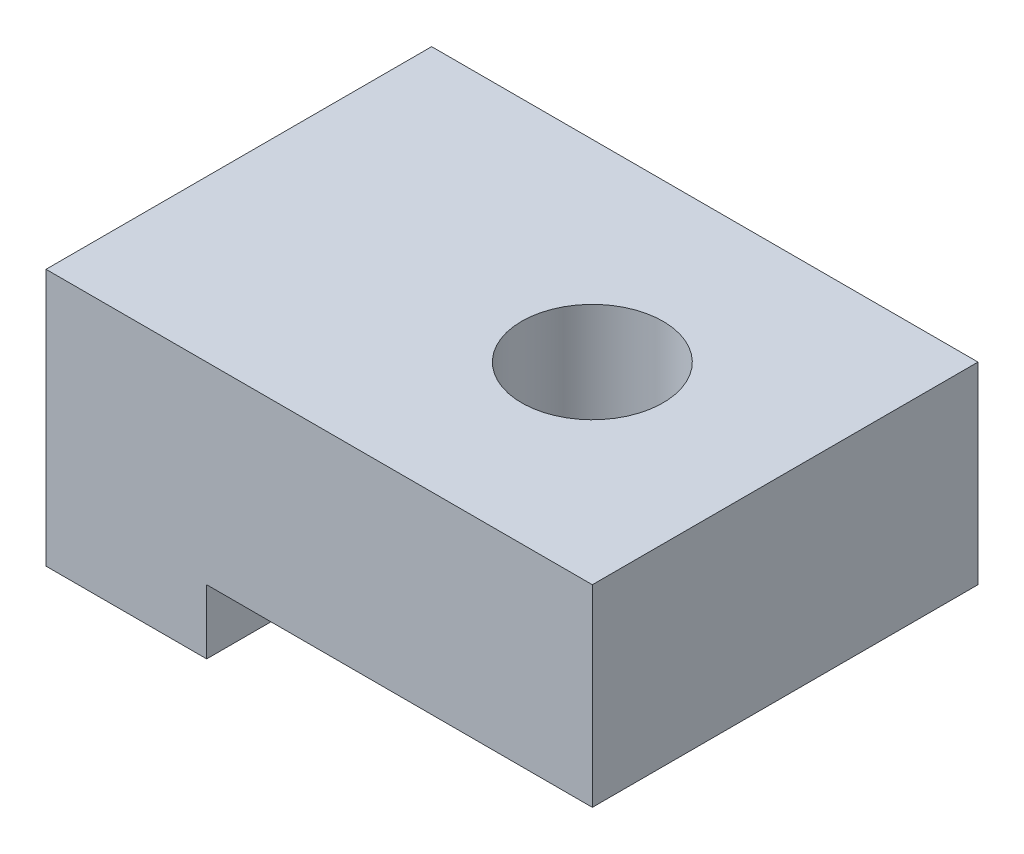
ISO-10303-21;
HEADER;
FILE_DESCRIPTION(('STEP AP214'),'2;1');
FILE_NAME('part.step','',(''),(''),'','','');
FILE_SCHEMA(('AUTOMOTIVE_DESIGN { 1 0 10303 214 1 1 1 1 }'));
ENDSEC;
DATA;
#1=APPLICATION_CONTEXT('core data for automotive mechanical design processes');
#2=APPLICATION_PROTOCOL_DEFINITION('international standard','automotive_design',2000,#1);
#3=PRODUCT_CONTEXT('',#1,'mechanical');
#4=PRODUCT('Part','Part','',(#3));
#5=PRODUCT_RELATED_PRODUCT_CATEGORY('part','',(#4));
#6=PRODUCT_DEFINITION_FORMATION('','',#4);
#7=PRODUCT_DEFINITION_CONTEXT('part definition',#1,'design');
#8=PRODUCT_DEFINITION('design','',#6,#7);
#9=PRODUCT_DEFINITION_SHAPE('','',#8);
#10=(LENGTH_UNIT() NAMED_UNIT(*) SI_UNIT(.MILLI.,.METRE.));
#11=(NAMED_UNIT(*) PLANE_ANGLE_UNIT() SI_UNIT($,.RADIAN.));
#12=(NAMED_UNIT(*) SI_UNIT($,.STERADIAN.) SOLID_ANGLE_UNIT());
#13=UNCERTAINTY_MEASURE_WITH_UNIT(LENGTH_MEASURE(1.E-05),#10,'distance_accuracy_value','');
#14=(GEOMETRIC_REPRESENTATION_CONTEXT(3) GLOBAL_UNCERTAINTY_ASSIGNED_CONTEXT((#13)) GLOBAL_UNIT_ASSIGNED_CONTEXT((#10,
#11,#12)) REPRESENTATION_CONTEXT('',''));
#15=CARTESIAN_POINT('',(0.,0.,0.));
#16=DIRECTION('',(0.,0.,1.));
#17=DIRECTION('',(1.,0.,0.));
#18=AXIS2_PLACEMENT_3D('',#15,#16,#17);
#19=CARTESIAN_POINT('',(0.,0.,30.));
#20=DIRECTION('',(-1.,0.,0.));
#21=DIRECTION('',(0.,-1.,0.));
#22=AXIS2_PLACEMENT_3D('',#19,#20,#21);
#23=PLANE('',#22);
#24=DIRECTION('',(0.,1.,0.));
#25=VECTOR('',#24,1.);
#26=CARTESIAN_POINT('',(0.,0.,30.));
#27=LINE('',#26,#25);
#28=CARTESIAN_POINT('',(0.,-30.,30.));
#29=VERTEX_POINT('',#28);
#30=CARTESIAN_POINT('',(0.,0.,30.));
#31=VERTEX_POINT('',#30);
#32=EDGE_CURVE('E82',#29,#31,#27,.T.);
#33=ORIENTED_EDGE('',*,*,#32,.F.);
#34=DIRECTION('',(0.,0.,1.));
#35=VECTOR('',#34,1.);
#36=CARTESIAN_POINT('',(0.,-30.,-30.));
#37=LINE('',#36,#35);
#38=CARTESIAN_POINT('',(0.,-30.,-30.));
#39=VERTEX_POINT('',#38);
#40=EDGE_CURVE('E104',#39,#29,#37,.T.);
#41=ORIENTED_EDGE('',*,*,#40,.F.);
#42=DIRECTION('',(0.,1.,0.));
#43=VECTOR('',#42,1.);
#44=CARTESIAN_POINT('',(0.,0.,-30.));
#45=LINE('',#44,#43);
#46=CARTESIAN_POINT('',(0.,0.,-30.));
#47=VERTEX_POINT('',#46);
#48=EDGE_CURVE('E130',#39,#47,#45,.T.);
#49=ORIENTED_EDGE('',*,*,#48,.T.);
#50=DIRECTION('',(0.,0.,-1.));
#51=VECTOR('',#50,1.);
#52=CARTESIAN_POINT('',(0.,0.,30.));
#53=LINE('',#52,#51);
#54=EDGE_CURVE('E11',#31,#47,#53,.T.);
#55=ORIENTED_EDGE('',*,*,#54,.F.);
#56=EDGE_LOOP('',(#33,#41,#49,#55));
#57=FACE_BOUND('',#56,.T.);
#58=ADVANCED_FACE('F36',(#57),#23,.F.);
#59=CARTESIAN_POINT('',(0.,0.,30.));
#60=DIRECTION('',(0.,-1.,0.));
#61=DIRECTION('',(1.,0.,0.));
#62=AXIS2_PLACEMENT_3D('',#59,#60,#61);
#63=PLANE('',#62);
#64=CARTESIAN_POINT('',(-30.,0.,0.));
#65=DIRECTION('',(0.,1.,0.));
#66=DIRECTION('',(-1.,0.,0.));
#67=AXIS2_PLACEMENT_3D('',#64,#65,#66);
#68=CIRCLE('',#67,11.);
#69=CARTESIAN_POINT('',(-41.,0.,0.));
#70=VERTEX_POINT('',#69);
#71=EDGE_CURVE('E147',#70,#70,#68,.T.);
#72=ORIENTED_EDGE('',*,*,#71,.F.);
#73=EDGE_LOOP('',(#72));
#74=FACE_BOUND('',#73,.T.);
#75=DIRECTION('',(-1.,0.,0.));
#76=VECTOR('',#75,1.);
#77=CARTESIAN_POINT('',(0.,0.,-30.));
#78=LINE('',#77,#76);
#79=CARTESIAN_POINT('',(-85.,0.,-30.));
#80=VERTEX_POINT('',#79);
#81=EDGE_CURVE('E120',#47,#80,#78,.T.);
#82=ORIENTED_EDGE('',*,*,#81,.T.);
#83=DIRECTION('',(0.,0.,-1.));
#84=VECTOR('',#83,1.);
#85=CARTESIAN_POINT('',(-85.,0.,30.));
#86=LINE('',#85,#84);
#87=CARTESIAN_POINT('',(-85.,0.,30.));
#88=VERTEX_POINT('',#87);
#89=EDGE_CURVE('E44',#88,#80,#86,.T.);
#90=ORIENTED_EDGE('',*,*,#89,.F.);
#91=DIRECTION('',(-1.,0.,0.));
#92=VECTOR('',#91,1.);
#93=CARTESIAN_POINT('',(0.,0.,30.));
#94=LINE('',#93,#92);
#95=EDGE_CURVE('E118',#31,#88,#94,.T.);
#96=ORIENTED_EDGE('',*,*,#95,.F.);
#97=ORIENTED_EDGE('',*,*,#54,.T.);
#98=EDGE_LOOP('',(#82,#90,#96,#97));
#99=FACE_BOUND('',#98,.T.);
#100=ADVANCED_FACE('F132',(#74,#99),#63,.F.);
#101=CARTESIAN_POINT('',(-85.,0.,30.));
#102=DIRECTION('',(1.,0.,0.));
#103=DIRECTION('',(0.,0.,-1.));
#104=AXIS2_PLACEMENT_3D('',#101,#102,#103);
#105=PLANE('',#104);
#106=DIRECTION('',(0.,-1.,0.));
#107=VECTOR('',#106,1.);
#108=CARTESIAN_POINT('',(-85.,0.,-30.));
#109=LINE('',#108,#107);
#110=CARTESIAN_POINT('',(-85.,-40.,-30.));
#111=VERTEX_POINT('',#110);
#112=EDGE_CURVE('E77',#80,#111,#109,.T.);
#113=ORIENTED_EDGE('',*,*,#112,.T.);
#114=DIRECTION('',(0.,0.,-1.));
#115=VECTOR('',#114,1.);
#116=CARTESIAN_POINT('',(-85.,-40.,30.));
#117=LINE('',#116,#115);
#118=CARTESIAN_POINT('',(-85.,-40.,30.));
#119=VERTEX_POINT('',#118);
#120=EDGE_CURVE('E116',#119,#111,#117,.T.);
#121=ORIENTED_EDGE('',*,*,#120,.F.);
#122=DIRECTION('',(0.,-1.,0.));
#123=VECTOR('',#122,1.);
#124=CARTESIAN_POINT('',(-85.,0.,30.));
#125=LINE('',#124,#123);
#126=EDGE_CURVE('E60',#88,#119,#125,.T.);
#127=ORIENTED_EDGE('',*,*,#126,.F.);
#128=ORIENTED_EDGE('',*,*,#89,.T.);
#129=EDGE_LOOP('',(#113,#121,#127,#128));
#130=FACE_BOUND('',#129,.T.);
#131=ADVANCED_FACE('F127',(#130),#105,.F.);
#132=CARTESIAN_POINT('',(0.,-40.,30.));
#133=DIRECTION('',(0.,1.,0.));
#134=DIRECTION('',(-1.,0.,0.));
#135=AXIS2_PLACEMENT_3D('',#132,#133,#134);
#136=PLANE('',#135);
#137=DIRECTION('',(1.,0.,0.));
#138=VECTOR('',#137,1.);
#139=CARTESIAN_POINT('',(0.,-40.,-30.));
#140=LINE('',#139,#138);
#141=CARTESIAN_POINT('',(-60.,-40.,-30.));
#142=VERTEX_POINT('',#141);
#143=EDGE_CURVE('E111',#111,#142,#140,.T.);
#144=ORIENTED_EDGE('',*,*,#143,.T.);
#145=DIRECTION('',(0.,0.,1.));
#146=VECTOR('',#145,1.);
#147=CARTESIAN_POINT('',(-60.,-40.,-30.));
#148=LINE('',#147,#146);
#149=CARTESIAN_POINT('',(-60.,-40.,30.));
#150=VERTEX_POINT('',#149);
#151=EDGE_CURVE('E97',#142,#150,#148,.T.);
#152=ORIENTED_EDGE('',*,*,#151,.T.);
#153=DIRECTION('',(1.,0.,0.));
#154=VECTOR('',#153,1.);
#155=CARTESIAN_POINT('',(0.,-40.,30.));
#156=LINE('',#155,#154);
#157=EDGE_CURVE('E125',#119,#150,#156,.T.);
#158=ORIENTED_EDGE('',*,*,#157,.F.);
#159=ORIENTED_EDGE('',*,*,#120,.T.);
#160=EDGE_LOOP('',(#144,#152,#158,#159));
#161=FACE_BOUND('',#160,.T.);
#162=ADVANCED_FACE('F115',(#161),#136,.F.);
#163=CARTESIAN_POINT('',(0.,0.,30.));
#164=DIRECTION('',(0.,0.,-1.));
#165=DIRECTION('',(-1.,0.,0.));
#166=AXIS2_PLACEMENT_3D('',#163,#164,#165);
#167=PLANE('',#166);
#168=ORIENTED_EDGE('',*,*,#157,.T.);
#169=DIRECTION('',(0.,-1.,0.));
#170=VECTOR('',#169,1.);
#171=CARTESIAN_POINT('',(-60.,-40.,30.));
#172=LINE('',#171,#170);
#173=CARTESIAN_POINT('',(-60.,-30.,30.));
#174=VERTEX_POINT('',#173);
#175=EDGE_CURVE('E100',#174,#150,#172,.T.);
#176=ORIENTED_EDGE('',*,*,#175,.F.);
#177=DIRECTION('',(-1.,0.,0.));
#178=VECTOR('',#177,1.);
#179=CARTESIAN_POINT('',(-60.,-30.,30.));
#180=LINE('',#179,#178);
#181=EDGE_CURVE('E113',#29,#174,#180,.T.);
#182=ORIENTED_EDGE('',*,*,#181,.F.);
#183=ORIENTED_EDGE('',*,*,#32,.T.);
#184=ORIENTED_EDGE('',*,*,#95,.T.);
#185=ORIENTED_EDGE('',*,*,#126,.T.);
#186=EDGE_LOOP('',(#168,#176,#182,#183,#184,#185));
#187=FACE_BOUND('',#186,.T.);
#188=ADVANCED_FACE('F176',(#187),#167,.F.);
#189=CARTESIAN_POINT('',(0.,0.,-30.));
#190=DIRECTION('',(0.,0.,-1.));
#191=DIRECTION('',(-1.,0.,0.));
#192=AXIS2_PLACEMENT_3D('',#189,#190,#191);
#193=PLANE('',#192);
#194=DIRECTION('',(0.,-1.,0.));
#195=VECTOR('',#194,1.);
#196=CARTESIAN_POINT('',(-60.,-40.,-30.));
#197=LINE('',#196,#195);
#198=CARTESIAN_POINT('',(-60.,-30.,-30.));
#199=VERTEX_POINT('',#198);
#200=EDGE_CURVE('E51',#199,#142,#197,.T.);
#201=ORIENTED_EDGE('',*,*,#200,.T.);
#202=ORIENTED_EDGE('',*,*,#143,.F.);
#203=ORIENTED_EDGE('',*,*,#112,.F.);
#204=ORIENTED_EDGE('',*,*,#81,.F.);
#205=ORIENTED_EDGE('',*,*,#48,.F.);
#206=DIRECTION('',(-1.,0.,0.));
#207=VECTOR('',#206,1.);
#208=CARTESIAN_POINT('',(-60.,-30.,-30.));
#209=LINE('',#208,#207);
#210=EDGE_CURVE('E105',#39,#199,#209,.T.);
#211=ORIENTED_EDGE('',*,*,#210,.T.);
#212=EDGE_LOOP('',(#201,#202,#203,#204,#205,#211));
#213=FACE_BOUND('',#212,.T.);
#214=ADVANCED_FACE('F110',(#213),#193,.T.);
#215=CARTESIAN_POINT('',(-60.,-40.,-30.));
#216=DIRECTION('',(-1.,0.,0.));
#217=DIRECTION('',(0.,0.,1.));
#218=AXIS2_PLACEMENT_3D('',#215,#216,#217);
#219=PLANE('',#218);
#220=ORIENTED_EDGE('',*,*,#175,.T.);
#221=ORIENTED_EDGE('',*,*,#151,.F.);
#222=ORIENTED_EDGE('',*,*,#200,.F.);
#223=DIRECTION('',(0.,0.,1.));
#224=VECTOR('',#223,1.);
#225=CARTESIAN_POINT('',(-60.,-30.,-30.));
#226=LINE('',#225,#224);
#227=EDGE_CURVE('E135',#199,#174,#226,.T.);
#228=ORIENTED_EDGE('',*,*,#227,.T.);
#229=EDGE_LOOP('',(#220,#221,#222,#228));
#230=FACE_BOUND('',#229,.T.);
#231=ADVANCED_FACE('F98',(#230),#219,.F.);
#232=CARTESIAN_POINT('',(-60.,-30.,-30.));
#233=DIRECTION('',(0.,1.,0.));
#234=DIRECTION('',(0.,0.,1.));
#235=AXIS2_PLACEMENT_3D('',#232,#233,#234);
#236=PLANE('',#235);
#237=CARTESIAN_POINT('',(-30.,-30.,0.));
#238=DIRECTION('',(0.,1.,0.));
#239=DIRECTION('',(0.,0.,1.));
#240=AXIS2_PLACEMENT_3D('',#237,#238,#239);
#241=CIRCLE('',#240,11.);
#242=CARTESIAN_POINT('',(-41.,-30.,0.));
#243=VERTEX_POINT('',#242);
#244=EDGE_CURVE('E39',#243,#243,#241,.T.);
#245=ORIENTED_EDGE('',*,*,#244,.T.);
#246=EDGE_LOOP('',(#245));
#247=FACE_BOUND('',#246,.T.);
#248=ORIENTED_EDGE('',*,*,#181,.T.);
#249=ORIENTED_EDGE('',*,*,#227,.F.);
#250=ORIENTED_EDGE('',*,*,#210,.F.);
#251=ORIENTED_EDGE('',*,*,#40,.T.);
#252=EDGE_LOOP('',(#248,#249,#250,#251));
#253=FACE_BOUND('',#252,.T.);
#254=ADVANCED_FACE('F154',(#247,#253),#236,.F.);
#255=CARTESIAN_POINT('',(-30.,-40.,0.));
#256=DIRECTION('',(0.,1.,0.));
#257=DIRECTION('',(-1.,0.,0.));
#258=AXIS2_PLACEMENT_3D('',#255,#256,#257);
#259=CYLINDRICAL_SURFACE('',#258,11.);
#260=CARTESIAN_POINT('',(-41.,0.,0.));
#261=CARTESIAN_POINT('',(-41.,-0.312500000000008,0.));
#262=CARTESIAN_POINT('',(-41.,-0.625000000000008,0.));
#263=CARTESIAN_POINT('',(-41.,-1.25000000000001,0.));
#264=CARTESIAN_POINT('',(-41.,-1.56250000000001,0.));
#265=CARTESIAN_POINT('',(-41.,-2.18750000000001,0.));
#266=CARTESIAN_POINT('',(-41.,-2.50000000000001,0.));
#267=CARTESIAN_POINT('',(-41.,-3.12500000000001,0.));
#268=CARTESIAN_POINT('',(-41.,-3.43750000000001,0.));
#269=CARTESIAN_POINT('',(-41.,-4.06250000000001,0.));
#270=CARTESIAN_POINT('',(-41.,-4.37500000000001,0.));
#271=CARTESIAN_POINT('',(-41.,-5.,0.));
#272=CARTESIAN_POINT('',(-41.,-5.3125,0.));
#273=CARTESIAN_POINT('',(-41.,-5.93750000000001,0.));
#274=CARTESIAN_POINT('',(-41.,-6.25000000000001,0.));
#275=CARTESIAN_POINT('',(-41.,-6.87500000000001,0.));
#276=CARTESIAN_POINT('',(-41.,-7.18750000000001,0.));
#277=CARTESIAN_POINT('',(-41.,-7.81250000000001,0.));
#278=CARTESIAN_POINT('',(-41.,-8.12500000000001,0.));
#279=CARTESIAN_POINT('',(-41.,-8.75000000000001,0.));
#280=CARTESIAN_POINT('',(-41.,-9.06250000000001,0.));
#281=CARTESIAN_POINT('',(-41.,-9.6875,0.));
#282=CARTESIAN_POINT('',(-41.,-10.,0.));
#283=CARTESIAN_POINT('',(-41.,-10.625,0.));
#284=CARTESIAN_POINT('',(-41.,-10.9375,0.));
#285=CARTESIAN_POINT('',(-41.,-11.5625,0.));
#286=CARTESIAN_POINT('',(-41.,-11.875,0.));
#287=CARTESIAN_POINT('',(-41.,-12.5,0.));
#288=CARTESIAN_POINT('',(-41.,-12.8125,0.));
#289=CARTESIAN_POINT('',(-41.,-13.4375,0.));
#290=CARTESIAN_POINT('',(-41.,-13.75,0.));
#291=CARTESIAN_POINT('',(-41.,-14.375,0.));
#292=CARTESIAN_POINT('',(-41.,-14.6875,0.));
#293=CARTESIAN_POINT('',(-41.,-15.3125,0.));
#294=CARTESIAN_POINT('',(-41.,-15.625,0.));
#295=CARTESIAN_POINT('',(-41.,-16.25,0.));
#296=CARTESIAN_POINT('',(-41.,-16.5625,0.));
#297=CARTESIAN_POINT('',(-41.,-17.1875,0.));
#298=CARTESIAN_POINT('',(-41.,-17.5,0.));
#299=CARTESIAN_POINT('',(-41.,-18.125,0.));
#300=CARTESIAN_POINT('',(-41.,-18.4375,0.));
#301=CARTESIAN_POINT('',(-41.,-19.0625,0.));
#302=CARTESIAN_POINT('',(-41.,-19.375,0.));
#303=CARTESIAN_POINT('',(-41.,-20.,0.));
#304=CARTESIAN_POINT('',(-41.,-20.3125,0.));
#305=CARTESIAN_POINT('',(-41.,-20.9375,0.));
#306=CARTESIAN_POINT('',(-41.,-21.25,0.));
#307=CARTESIAN_POINT('',(-41.,-21.875,0.));
#308=CARTESIAN_POINT('',(-41.,-22.1875,0.));
#309=CARTESIAN_POINT('',(-41.,-22.8125,0.));
#310=CARTESIAN_POINT('',(-41.,-23.125,0.));
#311=CARTESIAN_POINT('',(-41.,-23.75,0.));
#312=CARTESIAN_POINT('',(-41.,-24.0625,0.));
#313=CARTESIAN_POINT('',(-41.,-24.6875,0.));
#314=CARTESIAN_POINT('',(-41.,-25.,0.));
#315=CARTESIAN_POINT('',(-41.,-25.625,0.));
#316=CARTESIAN_POINT('',(-41.,-25.9375,0.));
#317=CARTESIAN_POINT('',(-41.,-26.5625,0.));
#318=CARTESIAN_POINT('',(-41.,-26.875,0.));
#319=CARTESIAN_POINT('',(-41.,-27.5,0.));
#320=CARTESIAN_POINT('',(-41.,-27.8125,0.));
#321=CARTESIAN_POINT('',(-41.,-28.4375,0.));
#322=CARTESIAN_POINT('',(-41.,-28.75,0.));
#323=CARTESIAN_POINT('',(-41.,-29.375,0.));
#324=CARTESIAN_POINT('',(-41.,-29.6875,0.));
#325=CARTESIAN_POINT('',(-41.,-30.,0.));
#326=B_SPLINE_CURVE_WITH_KNOTS('',3,(#260,#261,#262,#263,#264,#265,#266,#267,#268,#269,#270,
#271,#272,#273,#274,#275,#276,#277,#278,#279,#280,#281,#282,#283,#284,#285,#286,#287,#288,#289,
#290,#291,#292,#293,#294,#295,#296,#297,#298,#299,#300,#301,#302,#303,#304,#305,#306,#307,#308,
#309,#310,#311,#312,#313,#314,#315,#316,#317,#318,#319,#320,#321,#322,#323,#324,#325),
.UNSPECIFIED.,.F.,.F.,(4,2,2,2,2,2,2,2,2,2,2,2,2,2,2,2,2,2,2,2,2,2,2,2,2,2,2,2,2,2,2,2,4),(0.,
0.937500000000001,1.875,2.8125,3.75,4.6875,5.625,6.5625,7.5,8.4375,9.375,10.3125,11.25,12.1875,
13.125,14.0625,15.,15.9375,16.875,17.8125,18.75,19.6875,20.625,21.5625,22.5,23.4375,24.375,
25.3125,26.25,27.1875,28.125,29.0625,30.),.UNSPECIFIED.);
#327=EDGE_CURVE('BSEAM157',#70,#243,#326,.T.);
#328=ORIENTED_EDGE('',*,*,#71,.T.);
#329=ORIENTED_EDGE('',*,*,#244,.F.);
#330=ORIENTED_EDGE('',*,*,#327,.T.);
#331=ORIENTED_EDGE('',*,*,#327,.F.);
#332=EDGE_LOOP('',(#328,#330,#329,#331));
#333=FACE_BOUND('',#332,.T.);
#334=ADVANCED_FACE('F157',(#333),#259,.F.);
#335=CLOSED_SHELL('',(#58,#100,#131,#162,#188,#214,#231,#254,#334));
#336=MANIFOLD_SOLID_BREP('B2',#335);
#337=ADVANCED_BREP_SHAPE_REPRESENTATION('',(#18,#336),#14);
#338=SHAPE_DEFINITION_REPRESENTATION(#9,#337);
ENDSEC;
END-ISO-10303-21;
